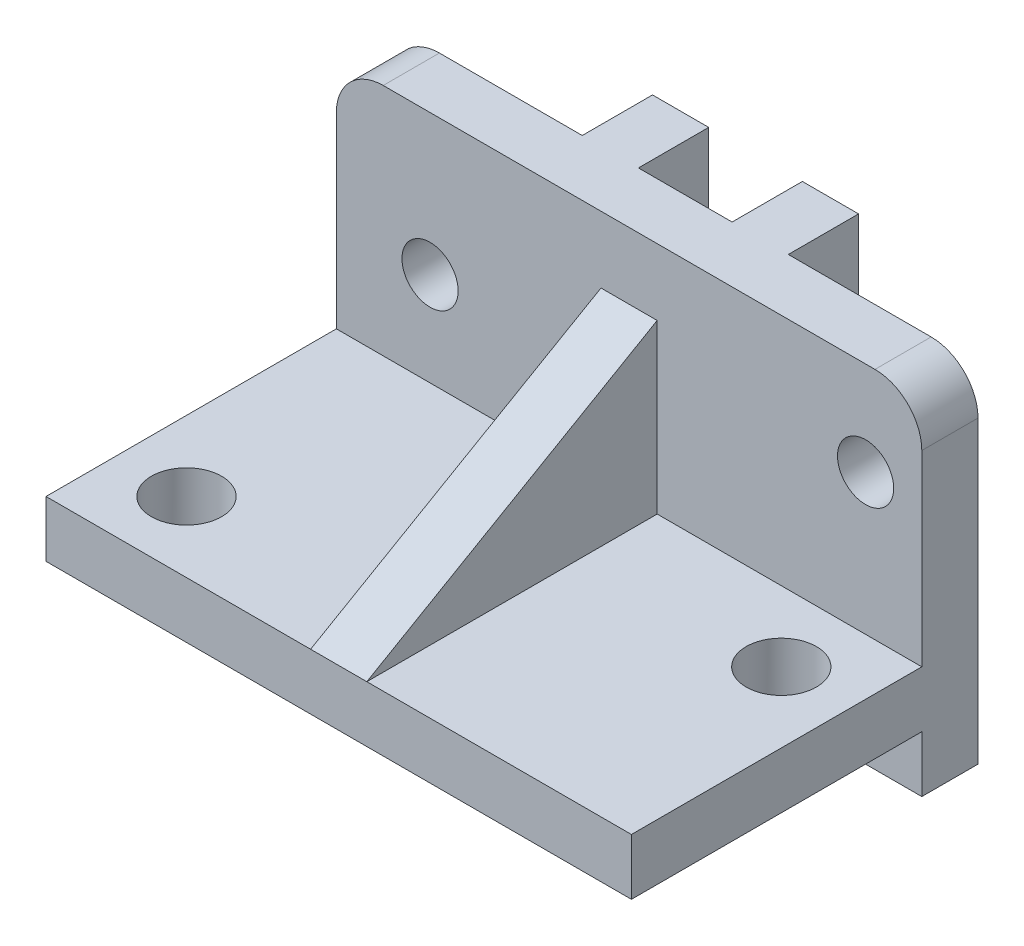
ISO-10303-21;
HEADER;
FILE_DESCRIPTION(('STEP AP214'),'2;1');
FILE_NAME('part.step','',(''),(''),'','','');
FILE_SCHEMA(('AUTOMOTIVE_DESIGN { 1 0 10303 214 1 1 1 1 }'));
ENDSEC;
DATA;
#1=APPLICATION_CONTEXT('core data for automotive mechanical design processes');
#2=APPLICATION_PROTOCOL_DEFINITION('international standard','automotive_design',2000,#1);
#3=PRODUCT_CONTEXT('',#1,'mechanical');
#4=PRODUCT('Part','Part','',(#3));
#5=PRODUCT_RELATED_PRODUCT_CATEGORY('part','',(#4));
#6=PRODUCT_DEFINITION_FORMATION('','',#4);
#7=PRODUCT_DEFINITION_CONTEXT('part definition',#1,'design');
#8=PRODUCT_DEFINITION('design','',#6,#7);
#9=PRODUCT_DEFINITION_SHAPE('','',#8);
#10=(LENGTH_UNIT() NAMED_UNIT(*) SI_UNIT(.MILLI.,.METRE.));
#11=(NAMED_UNIT(*) PLANE_ANGLE_UNIT() SI_UNIT($,.RADIAN.));
#12=(NAMED_UNIT(*) SI_UNIT($,.STERADIAN.) SOLID_ANGLE_UNIT());
#13=UNCERTAINTY_MEASURE_WITH_UNIT(LENGTH_MEASURE(1.E-05),#10,'distance_accuracy_value','');
#14=(GEOMETRIC_REPRESENTATION_CONTEXT(3) GLOBAL_UNCERTAINTY_ASSIGNED_CONTEXT((#13)) GLOBAL_UNIT_ASSIGNED_CONTEXT((#10,
#11,#12)) REPRESENTATION_CONTEXT('',''));
#15=CARTESIAN_POINT('',(0.,0.,0.));
#16=DIRECTION('',(0.,0.,1.));
#17=DIRECTION('',(1.,0.,0.));
#18=AXIS2_PLACEMENT_3D('',#15,#16,#17);
#19=CARTESIAN_POINT('',(-125.,12.,-62.));
#20=DIRECTION('',(0.,1.,0.));
#21=DIRECTION('',(0.,0.,1.));
#22=AXIS2_PLACEMENT_3D('',#19,#20,#21);
#23=PLANE('',#22);
#24=CARTESIAN_POINT('',(-15.,12.,-47.));
#25=DIRECTION('',(0.,1.,0.));
#26=DIRECTION('',(0.,0.,1.));
#27=AXIS2_PLACEMENT_3D('',#24,#25,#26);
#28=CIRCLE('',#27,7.5);
#29=CARTESIAN_POINT('',(-15.,12.,-39.5));
#30=VERTEX_POINT('',#29);
#31=EDGE_CURVE('E226',#30,#30,#28,.T.);
#32=ORIENTED_EDGE('',*,*,#31,.F.);
#33=EDGE_LOOP('',(#32));
#34=FACE_BOUND('',#33,.T.);
#35=DIRECTION('',(1.,0.,0.));
#36=VECTOR('',#35,1.);
#37=CARTESIAN_POINT('',(-125.,12.,-62.));
#38=LINE('',#37,#36);
#39=CARTESIAN_POINT('',(-56.5,12.,-62.));
#40=VERTEX_POINT('',#39);
#41=CARTESIAN_POINT('',(0.,12.,-62.));
#42=VERTEX_POINT('',#41);
#43=EDGE_CURVE('E194',#40,#42,#38,.T.);
#44=ORIENTED_EDGE('',*,*,#43,.F.);
#45=DIRECTION('',(0.,0.,-1.));
#46=VECTOR('',#45,1.);
#47=CARTESIAN_POINT('',(-56.5,12.,0.));
#48=LINE('',#47,#46);
#49=CARTESIAN_POINT('',(-56.5,12.,0.));
#50=VERTEX_POINT('',#49);
#51=EDGE_CURVE('E54',#50,#40,#48,.T.);
#52=ORIENTED_EDGE('',*,*,#51,.F.);
#53=DIRECTION('',(1.,0.,0.));
#54=VECTOR('',#53,1.);
#55=CARTESIAN_POINT('',(-125.,12.,0.));
#56=LINE('',#55,#54);
#57=CARTESIAN_POINT('',(0.,12.,0.));
#58=VERTEX_POINT('',#57);
#59=EDGE_CURVE('E193',#50,#58,#56,.T.);
#60=ORIENTED_EDGE('',*,*,#59,.T.);
#61=DIRECTION('',(0.,0.,1.));
#62=VECTOR('',#61,1.);
#63=CARTESIAN_POINT('',(0.,12.,-62.));
#64=LINE('',#63,#62);
#65=EDGE_CURVE('E289',#42,#58,#64,.T.);
#66=ORIENTED_EDGE('',*,*,#65,.F.);
#67=EDGE_LOOP('',(#44,#52,#60,#66));
#68=FACE_BOUND('',#67,.T.);
#69=ADVANCED_FACE('F37',(#34,#68),#23,.T.);
#70=CARTESIAN_POINT('',(-125.,62.,-62.));
#71=DIRECTION('',(0.,0.,1.));
#72=DIRECTION('',(0.,-1.,0.));
#73=AXIS2_PLACEMENT_3D('',#70,#71,#72);
#74=PLANE('',#73);
#75=CARTESIAN_POINT('',(-12.,42.,-62.));
#76=DIRECTION('',(0.,0.,1.));
#77=DIRECTION('',(1.,0.,0.));
#78=AXIS2_PLACEMENT_3D('',#75,#76,#77);
#79=CIRCLE('',#78,6.);
#80=CARTESIAN_POINT('',(-6.,42.,-62.));
#81=VERTEX_POINT('',#80);
#82=EDGE_CURVE('E218',#81,#81,#79,.T.);
#83=ORIENTED_EDGE('',*,*,#82,.F.);
#84=EDGE_LOOP('',(#83));
#85=FACE_BOUND('',#84,.T.);
#86=CARTESIAN_POINT('',(-105.,32.,-62.));
#87=DIRECTION('',(0.,0.,1.));
#88=DIRECTION('',(1.,0.,0.));
#89=AXIS2_PLACEMENT_3D('',#86,#87,#88);
#90=CIRCLE('',#89,6.);
#91=CARTESIAN_POINT('',(-99.,32.,-62.));
#92=VERTEX_POINT('',#91);
#93=EDGE_CURVE('E217',#92,#92,#90,.T.);
#94=ORIENTED_EDGE('',*,*,#93,.F.);
#95=EDGE_LOOP('',(#94));
#96=FACE_BOUND('',#95,.T.);
#97=DIRECTION('',(-1.,0.,0.));
#98=VECTOR('',#97,1.);
#99=CARTESIAN_POINT('',(-56.5,47.7957166897569,-62.));
#100=LINE('',#99,#98);
#101=CARTESIAN_POINT('',(-56.5,47.7957166897569,-62.));
#102=VERTEX_POINT('',#101);
#103=CARTESIAN_POINT('',(-68.5,47.7957166897569,-62.));
#104=VERTEX_POINT('',#103);
#105=EDGE_CURVE('E213',#102,#104,#100,.T.);
#106=ORIENTED_EDGE('',*,*,#105,.F.);
#107=DIRECTION('',(0.,1.,0.));
#108=VECTOR('',#107,1.);
#109=CARTESIAN_POINT('',(-56.5,47.7957166897569,-62.));
#110=LINE('',#109,#108);
#111=EDGE_CURVE('E215',#40,#102,#110,.T.);
#112=ORIENTED_EDGE('',*,*,#111,.F.);
#113=ORIENTED_EDGE('',*,*,#43,.T.);
#114=DIRECTION('',(0.,-1.,0.));
#115=VECTOR('',#114,1.);
#116=CARTESIAN_POINT('',(0.,62.,-62.));
#117=LINE('',#116,#115);
#118=CARTESIAN_POINT('',(0.,52.,-62.));
#119=VERTEX_POINT('',#118);
#120=EDGE_CURVE('E319',#119,#42,#117,.T.);
#121=ORIENTED_EDGE('',*,*,#120,.F.);
#122=CARTESIAN_POINT('',(-10.,52.,-62.));
#123=DIRECTION('',(0.,0.,1.));
#124=DIRECTION('',(0.,-1.,0.));
#125=AXIS2_PLACEMENT_3D('',#122,#123,#124);
#126=CIRCLE('',#125,10.);
#127=CARTESIAN_POINT('',(-9.99999999999999,62.,-62.));
#128=VERTEX_POINT('',#127);
#129=EDGE_CURVE('E349',#119,#128,#126,.T.);
#130=ORIENTED_EDGE('',*,*,#129,.T.);
#131=DIRECTION('',(1.,0.,0.));
#132=VECTOR('',#131,1.);
#133=CARTESIAN_POINT('',(-125.,62.,-62.));
#134=LINE('',#133,#132);
#135=CARTESIAN_POINT('',(-115.,62.,-62.));
#136=VERTEX_POINT('',#135);
#137=EDGE_CURVE('E326',#136,#128,#134,.T.);
#138=ORIENTED_EDGE('',*,*,#137,.F.);
#139=CARTESIAN_POINT('',(-115.,52.,-62.));
#140=DIRECTION('',(0.,0.,1.));
#141=DIRECTION('',(0.,-1.,0.));
#142=AXIS2_PLACEMENT_3D('',#139,#140,#141);
#143=CIRCLE('',#142,10.);
#144=CARTESIAN_POINT('',(-125.,52.,-62.));
#145=VERTEX_POINT('',#144);
#146=EDGE_CURVE('E351',#136,#145,#143,.T.);
#147=ORIENTED_EDGE('',*,*,#146,.T.);
#148=DIRECTION('',(0.,-1.,0.));
#149=VECTOR('',#148,1.);
#150=CARTESIAN_POINT('',(-125.,62.,-62.));
#151=LINE('',#150,#149);
#152=CARTESIAN_POINT('',(-125.,12.,-62.));
#153=VERTEX_POINT('',#152);
#154=EDGE_CURVE('E189',#145,#153,#151,.T.);
#155=ORIENTED_EDGE('',*,*,#154,.T.);
#156=CARTESIAN_POINT('',(-68.5,12.,-62.));
#157=VERTEX_POINT('',#156);
#158=EDGE_CURVE('E182',#153,#157,#38,.T.);
#159=ORIENTED_EDGE('',*,*,#158,.T.);
#160=DIRECTION('',(0.,1.,0.));
#161=VECTOR('',#160,1.);
#162=CARTESIAN_POINT('',(-68.5,47.7957166897569,-62.));
#163=LINE('',#162,#161);
#164=EDGE_CURVE('E186',#157,#104,#163,.T.);
#165=ORIENTED_EDGE('',*,*,#164,.T.);
#166=EDGE_LOOP('',(#106,#112,#113,#121,#130,#138,#147,#155,#159,#165));
#167=FACE_BOUND('',#166,.T.);
#168=ADVANCED_FACE('F184',(#85,#96,#167),#74,.T.);
#169=CARTESIAN_POINT('',(-125.,-12.,-74.));
#170=DIRECTION('',(0.,0.,-1.));
#171=DIRECTION('',(-1.,0.,0.));
#172=AXIS2_PLACEMENT_3D('',#169,#170,#171);
#173=PLANE('',#172);
#174=CARTESIAN_POINT('',(-12.,42.,-74.));
#175=DIRECTION('',(0.,0.,-1.));
#176=DIRECTION('',(-1.,0.,0.));
#177=AXIS2_PLACEMENT_3D('',#174,#175,#176);
#178=CIRCLE('',#177,6.);
#179=CARTESIAN_POINT('',(-18.,42.,-74.));
#180=VERTEX_POINT('',#179);
#181=EDGE_CURVE('E223',#180,#180,#178,.T.);
#182=ORIENTED_EDGE('',*,*,#181,.F.);
#183=EDGE_LOOP('',(#182));
#184=FACE_BOUND('',#183,.T.);
#185=DIRECTION('',(1.,0.,0.));
#186=VECTOR('',#185,1.);
#187=CARTESIAN_POINT('',(-125.,-12.,-74.));
#188=LINE('',#187,#186);
#189=CARTESIAN_POINT('',(-40.5,-12.,-74.));
#190=VERTEX_POINT('',#189);
#191=CARTESIAN_POINT('',(0.,-12.,-74.));
#192=VERTEX_POINT('',#191);
#193=EDGE_CURVE('E338',#190,#192,#188,.T.);
#194=ORIENTED_EDGE('',*,*,#193,.F.);
#195=DIRECTION('',(0.,1.,0.));
#196=VECTOR('',#195,1.);
#197=CARTESIAN_POINT('',(-40.5,-12.,-74.));
#198=LINE('',#197,#196);
#199=CARTESIAN_POINT('',(-40.5,62.,-74.));
#200=VERTEX_POINT('',#199);
#201=EDGE_CURVE('E236',#190,#200,#198,.T.);
#202=ORIENTED_EDGE('',*,*,#201,.T.);
#203=DIRECTION('',(1.,0.,0.));
#204=VECTOR('',#203,1.);
#205=CARTESIAN_POINT('',(-125.,62.,-74.));
#206=LINE('',#205,#204);
#207=CARTESIAN_POINT('',(-9.99999999999999,62.,-74.));
#208=VERTEX_POINT('',#207);
#209=EDGE_CURVE('E333',#200,#208,#206,.T.);
#210=ORIENTED_EDGE('',*,*,#209,.T.);
#211=CARTESIAN_POINT('',(-10.,52.,-74.));
#212=DIRECTION('',(0.,0.,-1.));
#213=DIRECTION('',(-1.,0.,0.));
#214=AXIS2_PLACEMENT_3D('',#211,#212,#213);
#215=CIRCLE('',#214,10.);
#216=CARTESIAN_POINT('',(0.,52.,-74.));
#217=VERTEX_POINT('',#216);
#218=EDGE_CURVE('E355',#208,#217,#215,.T.);
#219=ORIENTED_EDGE('',*,*,#218,.T.);
#220=DIRECTION('',(0.,1.,0.));
#221=VECTOR('',#220,1.);
#222=CARTESIAN_POINT('',(0.,-12.,-74.));
#223=LINE('',#222,#221);
#224=EDGE_CURVE('E316',#192,#217,#223,.T.);
#225=ORIENTED_EDGE('',*,*,#224,.F.);
#226=EDGE_LOOP('',(#194,#202,#210,#219,#225));
#227=FACE_BOUND('',#226,.T.);
#228=ADVANCED_FACE('F394',(#184,#227),#173,.T.);
#229=CARTESIAN_POINT('',(-72.5,62.,-74.));
#230=VERTEX_POINT('',#229);
#231=CARTESIAN_POINT('',(-52.5,62.,-74.));
#232=VERTEX_POINT('',#231);
#233=EDGE_CURVE('E332',#230,#232,#206,.T.);
#234=ORIENTED_EDGE('',*,*,#233,.T.);
#235=DIRECTION('',(0.,1.,0.));
#236=VECTOR('',#235,1.);
#237=CARTESIAN_POINT('',(-52.5,-12.,-74.));
#238=LINE('',#237,#236);
#239=CARTESIAN_POINT('',(-52.5,-12.,-74.));
#240=VERTEX_POINT('',#239);
#241=EDGE_CURVE('E240',#240,#232,#238,.T.);
#242=ORIENTED_EDGE('',*,*,#241,.F.);
#243=CARTESIAN_POINT('',(-72.5,-12.,-74.));
#244=VERTEX_POINT('',#243);
#245=EDGE_CURVE('E337',#244,#240,#188,.T.);
#246=ORIENTED_EDGE('',*,*,#245,.F.);
#247=DIRECTION('',(0.,1.,0.));
#248=VECTOR('',#247,1.);
#249=CARTESIAN_POINT('',(-72.5,-12.,-74.));
#250=LINE('',#249,#248);
#251=EDGE_CURVE('E268',#244,#230,#250,.T.);
#252=ORIENTED_EDGE('',*,*,#251,.T.);
#253=EDGE_LOOP('',(#234,#242,#246,#252));
#254=FACE_BOUND('',#253,.T.);
#255=ADVANCED_FACE('F440',(#254),#173,.T.);
#256=CARTESIAN_POINT('',(-125.,12.,0.));
#257=DIRECTION('',(0.,0.,1.));
#258=DIRECTION('',(1.,0.,0.));
#259=AXIS2_PLACEMENT_3D('',#256,#257,#258);
#260=PLANE('',#259);
#261=DIRECTION('',(0.,-1.,0.));
#262=VECTOR('',#261,1.);
#263=CARTESIAN_POINT('',(0.,12.,0.));
#264=LINE('',#263,#262);
#265=CARTESIAN_POINT('',(0.,0.,0.));
#266=VERTEX_POINT('',#265);
#267=EDGE_CURVE('E284',#58,#266,#264,.T.);
#268=ORIENTED_EDGE('',*,*,#267,.F.);
#269=ORIENTED_EDGE('',*,*,#59,.F.);
#270=DIRECTION('',(-1.,0.,0.));
#271=VECTOR('',#270,1.);
#272=CARTESIAN_POINT('',(-56.5,12.,0.));
#273=LINE('',#272,#271);
#274=CARTESIAN_POINT('',(-68.5,12.,0.));
#275=VERTEX_POINT('',#274);
#276=EDGE_CURVE('E61',#50,#275,#273,.T.);
#277=ORIENTED_EDGE('',*,*,#276,.T.);
#278=CARTESIAN_POINT('',(-125.,12.,0.));
#279=VERTEX_POINT('',#278);
#280=EDGE_CURVE('E200',#279,#275,#56,.T.);
#281=ORIENTED_EDGE('',*,*,#280,.F.);
#282=DIRECTION('',(0.,-1.,0.));
#283=VECTOR('',#282,1.);
#284=CARTESIAN_POINT('',(-125.,12.,0.));
#285=LINE('',#284,#283);
#286=CARTESIAN_POINT('',(-125.,0.,0.));
#287=VERTEX_POINT('',#286);
#288=EDGE_CURVE('E285',#279,#287,#285,.T.);
#289=ORIENTED_EDGE('',*,*,#288,.T.);
#290=DIRECTION('',(1.,0.,0.));
#291=VECTOR('',#290,1.);
#292=CARTESIAN_POINT('',(-125.,0.,0.));
#293=LINE('',#292,#291);
#294=EDGE_CURVE('E304',#287,#266,#293,.T.);
#295=ORIENTED_EDGE('',*,*,#294,.T.);
#296=EDGE_LOOP('',(#268,#269,#277,#281,#289,#295));
#297=FACE_BOUND('',#296,.T.);
#298=ADVANCED_FACE('F380',(#297),#260,.T.);
#299=DIRECTION('',(0.,0.,-1.));
#300=VECTOR('',#299,1.);
#301=CARTESIAN_POINT('',(-68.5,12.,0.));
#302=LINE('',#301,#300);
#303=EDGE_CURVE('E197',#275,#157,#302,.T.);
#304=ORIENTED_EDGE('',*,*,#303,.T.);
#305=ORIENTED_EDGE('',*,*,#158,.F.);
#306=DIRECTION('',(0.,0.,1.));
#307=VECTOR('',#306,1.);
#308=CARTESIAN_POINT('',(-125.,12.,-62.));
#309=LINE('',#308,#307);
#310=EDGE_CURVE('E302',#153,#279,#309,.T.);
#311=ORIENTED_EDGE('',*,*,#310,.T.);
#312=ORIENTED_EDGE('',*,*,#280,.T.);
#313=EDGE_LOOP('',(#304,#305,#311,#312));
#314=FACE_BOUND('',#313,.T.);
#315=CARTESIAN_POINT('',(-110.,12.,-15.));
#316=DIRECTION('',(0.,1.,0.));
#317=DIRECTION('',(0.,0.,1.));
#318=AXIS2_PLACEMENT_3D('',#315,#316,#317);
#319=CIRCLE('',#318,7.50000000000001);
#320=CARTESIAN_POINT('',(-110.,12.,-7.49999999999998));
#321=VERTEX_POINT('',#320);
#322=EDGE_CURVE('E227',#321,#321,#319,.T.);
#323=ORIENTED_EDGE('',*,*,#322,.F.);
#324=EDGE_LOOP('',(#323));
#325=FACE_BOUND('',#324,.T.);
#326=ADVANCED_FACE('F198',(#314,#325),#23,.T.);
#327=CARTESIAN_POINT('',(-125.,62.,-74.));
#328=DIRECTION('',(0.,1.,0.));
#329=DIRECTION('',(0.,0.,1.));
#330=AXIS2_PLACEMENT_3D('',#327,#328,#329);
#331=PLANE('',#330);
#332=CARTESIAN_POINT('',(-115.,62.,-74.));
#333=VERTEX_POINT('',#332);
#334=CARTESIAN_POINT('',(-84.5,62.,-74.));
#335=VERTEX_POINT('',#334);
#336=EDGE_CURVE('E329',#333,#335,#206,.T.);
#337=ORIENTED_EDGE('',*,*,#336,.F.);
#338=DIRECTION('',(0.,0.,1.));
#339=VECTOR('',#338,1.);
#340=CARTESIAN_POINT('',(-115.,62.,-62.));
#341=LINE('',#340,#339);
#342=EDGE_CURVE('E346',#333,#136,#341,.T.);
#343=ORIENTED_EDGE('',*,*,#342,.T.);
#344=ORIENTED_EDGE('',*,*,#137,.T.);
#345=DIRECTION('',(0.,0.,1.));
#346=VECTOR('',#345,1.);
#347=CARTESIAN_POINT('',(-9.99999999999999,62.,-74.));
#348=LINE('',#347,#346);
#349=EDGE_CURVE('E324',#128,#208,#348,.F.);
#350=ORIENTED_EDGE('',*,*,#349,.T.);
#351=ORIENTED_EDGE('',*,*,#209,.F.);
#352=DIRECTION('',(0.,0.,1.));
#353=VECTOR('',#352,1.);
#354=CARTESIAN_POINT('',(-40.5,62.,-89.));
#355=LINE('',#354,#353);
#356=CARTESIAN_POINT('',(-40.5,62.,-89.));
#357=VERTEX_POINT('',#356);
#358=EDGE_CURVE('E248',#357,#200,#355,.T.);
#359=ORIENTED_EDGE('',*,*,#358,.F.);
#360=DIRECTION('',(1.,0.,0.));
#361=VECTOR('',#360,1.);
#362=CARTESIAN_POINT('',(-52.5,62.,-89.));
#363=LINE('',#362,#361);
#364=CARTESIAN_POINT('',(-52.5,62.,-89.));
#365=VERTEX_POINT('',#364);
#366=EDGE_CURVE('E251',#365,#357,#363,.T.);
#367=ORIENTED_EDGE('',*,*,#366,.F.);
#368=DIRECTION('',(0.,0.,-1.));
#369=VECTOR('',#368,1.);
#370=CARTESIAN_POINT('',(-52.5,62.,-74.));
#371=LINE('',#370,#369);
#372=EDGE_CURVE('E246',#232,#365,#371,.T.);
#373=ORIENTED_EDGE('',*,*,#372,.F.);
#374=ORIENTED_EDGE('',*,*,#233,.F.);
#375=DIRECTION('',(0.,0.,1.));
#376=VECTOR('',#375,1.);
#377=CARTESIAN_POINT('',(-72.5,62.,-74.));
#378=LINE('',#377,#376);
#379=CARTESIAN_POINT('',(-72.5,62.,-89.));
#380=VERTEX_POINT('',#379);
#381=EDGE_CURVE('E264',#380,#230,#378,.T.);
#382=ORIENTED_EDGE('',*,*,#381,.F.);
#383=DIRECTION('',(1.,0.,0.));
#384=VECTOR('',#383,1.);
#385=CARTESIAN_POINT('',(-72.5,62.,-89.));
#386=LINE('',#385,#384);
#387=CARTESIAN_POINT('',(-84.5,62.,-89.));
#388=VERTEX_POINT('',#387);
#389=EDGE_CURVE('E270',#388,#380,#386,.T.);
#390=ORIENTED_EDGE('',*,*,#389,.F.);
#391=DIRECTION('',(0.,0.,-1.));
#392=VECTOR('',#391,1.);
#393=CARTESIAN_POINT('',(-84.5,62.,-89.));
#394=LINE('',#393,#392);
#395=EDGE_CURVE('E254',#335,#388,#394,.T.);
#396=ORIENTED_EDGE('',*,*,#395,.F.);
#397=EDGE_LOOP('',(#337,#343,#344,#350,#351,#359,#367,#373,#374,#382,#390,#396));
#398=FACE_BOUND('',#397,.T.);
#399=ADVANCED_FACE('F432',(#398),#331,.T.);
#400=CARTESIAN_POINT('',(-105.,32.,-74.));
#401=DIRECTION('',(0.,0.,-1.));
#402=DIRECTION('',(-1.,0.,0.));
#403=AXIS2_PLACEMENT_3D('',#400,#401,#402);
#404=CIRCLE('',#403,6.);
#405=CARTESIAN_POINT('',(-111.,32.,-74.));
#406=VERTEX_POINT('',#405);
#407=EDGE_CURVE('E41',#406,#406,#404,.T.);
#408=ORIENTED_EDGE('',*,*,#407,.F.);
#409=EDGE_LOOP('',(#408));
#410=FACE_BOUND('',#409,.T.);
#411=DIRECTION('',(0.,1.,0.));
#412=VECTOR('',#411,1.);
#413=CARTESIAN_POINT('',(-84.5,-12.,-74.));
#414=LINE('',#413,#412);
#415=CARTESIAN_POINT('',(-84.5,-12.,-74.));
#416=VERTEX_POINT('',#415);
#417=EDGE_CURVE('E281',#416,#335,#414,.T.);
#418=ORIENTED_EDGE('',*,*,#417,.F.);
#419=CARTESIAN_POINT('',(-125.,-12.,-74.));
#420=VERTEX_POINT('',#419);
#421=EDGE_CURVE('E334',#420,#416,#188,.T.);
#422=ORIENTED_EDGE('',*,*,#421,.F.);
#423=DIRECTION('',(0.,1.,0.));
#424=VECTOR('',#423,1.);
#425=CARTESIAN_POINT('',(-125.,-12.,-74.));
#426=LINE('',#425,#424);
#427=CARTESIAN_POINT('',(-125.,52.,-74.));
#428=VERTEX_POINT('',#427);
#429=EDGE_CURVE('E298',#420,#428,#426,.T.);
#430=ORIENTED_EDGE('',*,*,#429,.T.);
#431=CARTESIAN_POINT('',(-115.,52.,-74.));
#432=DIRECTION('',(0.,0.,-1.));
#433=DIRECTION('',(-1.,0.,0.));
#434=AXIS2_PLACEMENT_3D('',#431,#432,#433);
#435=CIRCLE('',#434,10.);
#436=EDGE_CURVE('E46',#428,#333,#435,.T.);
#437=ORIENTED_EDGE('',*,*,#436,.T.);
#438=ORIENTED_EDGE('',*,*,#336,.T.);
#439=EDGE_LOOP('',(#418,#422,#430,#437,#438));
#440=FACE_BOUND('',#439,.T.);
#441=ADVANCED_FACE('F437',(#410,#440),#173,.T.);
#442=CARTESIAN_POINT('',(-125.,-12.,-62.));
#443=DIRECTION('',(0.,-1.,0.));
#444=DIRECTION('',(0.,0.,-1.));
#445=AXIS2_PLACEMENT_3D('',#442,#443,#444);
#446=PLANE('',#445);
#447=DIRECTION('',(0.,0.,-1.));
#448=VECTOR('',#447,1.);
#449=CARTESIAN_POINT('',(0.,-12.,-62.));
#450=LINE('',#449,#448);
#451=CARTESIAN_POINT('',(0.,-12.,-62.));
#452=VERTEX_POINT('',#451);
#453=EDGE_CURVE('E313',#452,#192,#450,.T.);
#454=ORIENTED_EDGE('',*,*,#453,.F.);
#455=DIRECTION('',(1.,0.,0.));
#456=VECTOR('',#455,1.);
#457=CARTESIAN_POINT('',(-125.,-12.,-62.));
#458=LINE('',#457,#456);
#459=CARTESIAN_POINT('',(-125.,-12.,-62.));
#460=VERTEX_POINT('',#459);
#461=EDGE_CURVE('E339',#460,#452,#458,.T.);
#462=ORIENTED_EDGE('',*,*,#461,.F.);
#463=DIRECTION('',(0.,0.,-1.));
#464=VECTOR('',#463,1.);
#465=CARTESIAN_POINT('',(-125.,-12.,-62.));
#466=LINE('',#465,#464);
#467=EDGE_CURVE('E295',#460,#420,#466,.T.);
#468=ORIENTED_EDGE('',*,*,#467,.T.);
#469=ORIENTED_EDGE('',*,*,#421,.T.);
#470=DIRECTION('',(0.,0.,-1.));
#471=VECTOR('',#470,1.);
#472=CARTESIAN_POINT('',(-84.5,-12.,-89.));
#473=LINE('',#472,#471);
#474=CARTESIAN_POINT('',(-84.5,-12.,-89.));
#475=VERTEX_POINT('',#474);
#476=EDGE_CURVE('E261',#416,#475,#473,.T.);
#477=ORIENTED_EDGE('',*,*,#476,.T.);
#478=DIRECTION('',(1.,0.,0.));
#479=VECTOR('',#478,1.);
#480=CARTESIAN_POINT('',(-72.5,-12.,-89.));
#481=LINE('',#480,#479);
#482=CARTESIAN_POINT('',(-72.5,-12.,-89.));
#483=VERTEX_POINT('',#482);
#484=EDGE_CURVE('E263',#475,#483,#481,.T.);
#485=ORIENTED_EDGE('',*,*,#484,.T.);
#486=DIRECTION('',(0.,0.,1.));
#487=VECTOR('',#486,1.);
#488=CARTESIAN_POINT('',(-72.5,-12.,-74.));
#489=LINE('',#488,#487);
#490=EDGE_CURVE('E266',#483,#244,#489,.T.);
#491=ORIENTED_EDGE('',*,*,#490,.T.);
#492=ORIENTED_EDGE('',*,*,#245,.T.);
#493=DIRECTION('',(0.,0.,-1.));
#494=VECTOR('',#493,1.);
#495=CARTESIAN_POINT('',(-52.5,-12.,-74.));
#496=LINE('',#495,#494);
#497=CARTESIAN_POINT('',(-52.5,-12.,-89.));
#498=VERTEX_POINT('',#497);
#499=EDGE_CURVE('E245',#240,#498,#496,.T.);
#500=ORIENTED_EDGE('',*,*,#499,.T.);
#501=DIRECTION('',(1.,0.,0.));
#502=VECTOR('',#501,1.);
#503=CARTESIAN_POINT('',(-52.5,-12.,-89.));
#504=LINE('',#503,#502);
#505=CARTESIAN_POINT('',(-40.5,-12.,-89.));
#506=VERTEX_POINT('',#505);
#507=EDGE_CURVE('E249',#498,#506,#504,.T.);
#508=ORIENTED_EDGE('',*,*,#507,.T.);
#509=DIRECTION('',(0.,0.,1.));
#510=VECTOR('',#509,1.);
#511=CARTESIAN_POINT('',(-40.5,-12.,-89.));
#512=LINE('',#511,#510);
#513=EDGE_CURVE('E256',#506,#190,#512,.T.);
#514=ORIENTED_EDGE('',*,*,#513,.T.);
#515=ORIENTED_EDGE('',*,*,#193,.T.);
#516=EDGE_LOOP('',(#454,#462,#468,#469,#477,#485,#491,#492,#500,#508,#514,#515));
#517=FACE_BOUND('',#516,.T.);
#518=ADVANCED_FACE('F391',(#517),#446,.T.);
#519=CARTESIAN_POINT('',(-125.,0.,-62.));
#520=DIRECTION('',(0.,0.,1.));
#521=DIRECTION('',(0.,-1.,0.));
#522=AXIS2_PLACEMENT_3D('',#519,#520,#521);
#523=PLANE('',#522);
#524=DIRECTION('',(0.,-1.,0.));
#525=VECTOR('',#524,1.);
#526=CARTESIAN_POINT('',(0.,0.,-62.));
#527=LINE('',#526,#525);
#528=CARTESIAN_POINT('',(0.,0.,-62.));
#529=VERTEX_POINT('',#528);
#530=EDGE_CURVE('E310',#529,#452,#527,.T.);
#531=ORIENTED_EDGE('',*,*,#530,.F.);
#532=DIRECTION('',(1.,0.,0.));
#533=VECTOR('',#532,1.);
#534=CARTESIAN_POINT('',(-125.,0.,-62.));
#535=LINE('',#534,#533);
#536=CARTESIAN_POINT('',(-125.,0.,-62.));
#537=VERTEX_POINT('',#536);
#538=EDGE_CURVE('E341',#537,#529,#535,.T.);
#539=ORIENTED_EDGE('',*,*,#538,.F.);
#540=DIRECTION('',(0.,-1.,0.));
#541=VECTOR('',#540,1.);
#542=CARTESIAN_POINT('',(-125.,0.,-62.));
#543=LINE('',#542,#541);
#544=EDGE_CURVE('E292',#537,#460,#543,.T.);
#545=ORIENTED_EDGE('',*,*,#544,.T.);
#546=ORIENTED_EDGE('',*,*,#461,.T.);
#547=EDGE_LOOP('',(#531,#539,#545,#546));
#548=FACE_BOUND('',#547,.T.);
#549=ADVANCED_FACE('F369',(#548),#523,.T.);
#550=CARTESIAN_POINT('',(-125.,0.,0.));
#551=DIRECTION('',(0.,-1.,0.));
#552=DIRECTION('',(0.,0.,-1.));
#553=AXIS2_PLACEMENT_3D('',#550,#551,#552);
#554=PLANE('',#553);
#555=CARTESIAN_POINT('',(-110.,0.,-15.));
#556=DIRECTION('',(0.,-1.,0.));
#557=DIRECTION('',(0.,0.,-1.));
#558=AXIS2_PLACEMENT_3D('',#555,#556,#557);
#559=CIRCLE('',#558,7.50000000000001);
#560=CARTESIAN_POINT('',(-110.,0.,-22.5));
#561=VERTEX_POINT('',#560);
#562=EDGE_CURVE('E237',#561,#561,#559,.T.);
#563=ORIENTED_EDGE('',*,*,#562,.F.);
#564=EDGE_LOOP('',(#563));
#565=FACE_BOUND('',#564,.T.);
#566=CARTESIAN_POINT('',(-15.,0.,-47.));
#567=DIRECTION('',(0.,-1.,0.));
#568=DIRECTION('',(0.,0.,-1.));
#569=AXIS2_PLACEMENT_3D('',#566,#567,#568);
#570=CIRCLE('',#569,7.5);
#571=CARTESIAN_POINT('',(-15.,0.,-54.5));
#572=VERTEX_POINT('',#571);
#573=EDGE_CURVE('E230',#572,#572,#570,.T.);
#574=ORIENTED_EDGE('',*,*,#573,.F.);
#575=EDGE_LOOP('',(#574));
#576=FACE_BOUND('',#575,.T.);
#577=DIRECTION('',(0.,0.,-1.));
#578=VECTOR('',#577,1.);
#579=CARTESIAN_POINT('',(0.,0.,0.));
#580=LINE('',#579,#578);
#581=EDGE_CURVE('E307',#266,#529,#580,.T.);
#582=ORIENTED_EDGE('',*,*,#581,.F.);
#583=ORIENTED_EDGE('',*,*,#294,.F.);
#584=DIRECTION('',(0.,0.,-1.));
#585=VECTOR('',#584,1.);
#586=CARTESIAN_POINT('',(-125.,0.,0.));
#587=LINE('',#586,#585);
#588=EDGE_CURVE('E288',#287,#537,#587,.T.);
#589=ORIENTED_EDGE('',*,*,#588,.T.);
#590=ORIENTED_EDGE('',*,*,#538,.T.);
#591=EDGE_LOOP('',(#582,#583,#589,#590));
#592=FACE_BOUND('',#591,.T.);
#593=ADVANCED_FACE('F365',(#565,#576,#592),#554,.T.);
#594=CARTESIAN_POINT('',(-125.,0.,0.));
#595=DIRECTION('',(1.,0.,0.));
#596=DIRECTION('',(0.,0.,-1.));
#597=AXIS2_PLACEMENT_3D('',#594,#595,#596);
#598=PLANE('',#597);
#599=ORIENTED_EDGE('',*,*,#154,.F.);
#600=DIRECTION('',(0.,0.,1.));
#601=VECTOR('',#600,1.);
#602=CARTESIAN_POINT('',(-125.,52.,-74.));
#603=LINE('',#602,#601);
#604=EDGE_CURVE('E353',#145,#428,#603,.F.);
#605=ORIENTED_EDGE('',*,*,#604,.T.);
#606=ORIENTED_EDGE('',*,*,#429,.F.);
#607=ORIENTED_EDGE('',*,*,#467,.F.);
#608=ORIENTED_EDGE('',*,*,#544,.F.);
#609=ORIENTED_EDGE('',*,*,#588,.F.);
#610=ORIENTED_EDGE('',*,*,#288,.F.);
#611=ORIENTED_EDGE('',*,*,#310,.F.);
#612=EDGE_LOOP('',(#599,#605,#606,#607,#608,#609,#610,#611));
#613=FACE_BOUND('',#612,.T.);
#614=ADVANCED_FACE('F368',(#613),#598,.F.);
#615=CARTESIAN_POINT('',(0.,0.,0.));
#616=DIRECTION('',(1.,0.,0.));
#617=DIRECTION('',(0.,0.,-1.));
#618=AXIS2_PLACEMENT_3D('',#615,#616,#617);
#619=PLANE('',#618);
#620=ORIENTED_EDGE('',*,*,#224,.T.);
#621=DIRECTION('',(0.,0.,1.));
#622=VECTOR('',#621,1.);
#623=CARTESIAN_POINT('',(0.,51.9999999999999,0.));
#624=LINE('',#623,#622);
#625=EDGE_CURVE('E11',#217,#119,#624,.T.);
#626=ORIENTED_EDGE('',*,*,#625,.T.);
#627=ORIENTED_EDGE('',*,*,#120,.T.);
#628=ORIENTED_EDGE('',*,*,#65,.T.);
#629=ORIENTED_EDGE('',*,*,#267,.T.);
#630=ORIENTED_EDGE('',*,*,#581,.T.);
#631=ORIENTED_EDGE('',*,*,#530,.T.);
#632=ORIENTED_EDGE('',*,*,#453,.T.);
#633=EDGE_LOOP('',(#620,#626,#627,#628,#629,#630,#631,#632));
#634=FACE_BOUND('',#633,.T.);
#635=ADVANCED_FACE('F378',(#634),#619,.T.);
#636=CARTESIAN_POINT('',(-115.,52.,-74.));
#637=DIRECTION('',(0.,0.,-1.));
#638=DIRECTION('',(0.,1.,0.));
#639=AXIS2_PLACEMENT_3D('',#636,#637,#638);
#640=CYLINDRICAL_SURFACE('',#639,10.);
#641=ORIENTED_EDGE('',*,*,#436,.F.);
#642=ORIENTED_EDGE('',*,*,#604,.F.);
#643=ORIENTED_EDGE('',*,*,#146,.F.);
#644=ORIENTED_EDGE('',*,*,#342,.F.);
#645=EDGE_LOOP('',(#641,#642,#643,#644));
#646=FACE_BOUND('',#645,.T.);
#647=ADVANCED_FACE('F448',(#646),#640,.T.);
#648=CARTESIAN_POINT('',(-10.,51.9999999999999,0.));
#649=DIRECTION('',(0.,0.,1.));
#650=DIRECTION('',(0.,-1.,0.));
#651=AXIS2_PLACEMENT_3D('',#648,#649,#650);
#652=CYLINDRICAL_SURFACE('',#651,10.);
#653=ORIENTED_EDGE('',*,*,#218,.F.);
#654=ORIENTED_EDGE('',*,*,#349,.F.);
#655=ORIENTED_EDGE('',*,*,#129,.F.);
#656=ORIENTED_EDGE('',*,*,#625,.F.);
#657=EDGE_LOOP('',(#653,#654,#655,#656));
#658=FACE_BOUND('',#657,.T.);
#659=ADVANCED_FACE('F39',(#658),#652,.T.);
#660=CARTESIAN_POINT('',(-84.5,-12.,-89.));
#661=DIRECTION('',(1.,0.,0.));
#662=DIRECTION('',(0.,0.,-1.));
#663=AXIS2_PLACEMENT_3D('',#660,#661,#662);
#664=PLANE('',#663);
#665=ORIENTED_EDGE('',*,*,#395,.T.);
#666=DIRECTION('',(0.,1.,0.));
#667=VECTOR('',#666,1.);
#668=CARTESIAN_POINT('',(-84.5,-12.,-89.));
#669=LINE('',#668,#667);
#670=EDGE_CURVE('E278',#475,#388,#669,.T.);
#671=ORIENTED_EDGE('',*,*,#670,.F.);
#672=ORIENTED_EDGE('',*,*,#476,.F.);
#673=ORIENTED_EDGE('',*,*,#417,.T.);
#674=EDGE_LOOP('',(#665,#671,#672,#673));
#675=FACE_BOUND('',#674,.T.);
#676=ADVANCED_FACE('F455',(#675),#664,.F.);
#677=CARTESIAN_POINT('',(-72.5,-12.,-89.));
#678=DIRECTION('',(0.,0.,1.));
#679=DIRECTION('',(1.,0.,0.));
#680=AXIS2_PLACEMENT_3D('',#677,#678,#679);
#681=PLANE('',#680);
#682=ORIENTED_EDGE('',*,*,#389,.T.);
#683=DIRECTION('',(0.,1.,0.));
#684=VECTOR('',#683,1.);
#685=CARTESIAN_POINT('',(-72.5,-12.,-89.));
#686=LINE('',#685,#684);
#687=EDGE_CURVE('E275',#483,#380,#686,.T.);
#688=ORIENTED_EDGE('',*,*,#687,.F.);
#689=ORIENTED_EDGE('',*,*,#484,.F.);
#690=ORIENTED_EDGE('',*,*,#670,.T.);
#691=EDGE_LOOP('',(#682,#688,#689,#690));
#692=FACE_BOUND('',#691,.T.);
#693=ADVANCED_FACE('F469',(#692),#681,.F.);
#694=CARTESIAN_POINT('',(-72.5,-12.,-74.));
#695=DIRECTION('',(-1.,0.,0.));
#696=DIRECTION('',(0.,0.,1.));
#697=AXIS2_PLACEMENT_3D('',#694,#695,#696);
#698=PLANE('',#697);
#699=ORIENTED_EDGE('',*,*,#381,.T.);
#700=ORIENTED_EDGE('',*,*,#251,.F.);
#701=ORIENTED_EDGE('',*,*,#490,.F.);
#702=ORIENTED_EDGE('',*,*,#687,.T.);
#703=EDGE_LOOP('',(#699,#700,#701,#702));
#704=FACE_BOUND('',#703,.T.);
#705=ADVANCED_FACE('F473',(#704),#698,.F.);
#706=CARTESIAN_POINT('',(-52.5,-12.,-89.));
#707=DIRECTION('',(0.,0.,1.));
#708=DIRECTION('',(1.,0.,0.));
#709=AXIS2_PLACEMENT_3D('',#706,#707,#708);
#710=PLANE('',#709);
#711=ORIENTED_EDGE('',*,*,#366,.T.);
#712=DIRECTION('',(0.,1.,0.));
#713=VECTOR('',#712,1.);
#714=CARTESIAN_POINT('',(-40.5,-12.,-89.));
#715=LINE('',#714,#713);
#716=EDGE_CURVE('E233',#506,#357,#715,.T.);
#717=ORIENTED_EDGE('',*,*,#716,.F.);
#718=ORIENTED_EDGE('',*,*,#507,.F.);
#719=DIRECTION('',(0.,1.,0.));
#720=VECTOR('',#719,1.);
#721=CARTESIAN_POINT('',(-52.5,-12.,-89.));
#722=LINE('',#721,#720);
#723=EDGE_CURVE('E242',#498,#365,#722,.T.);
#724=ORIENTED_EDGE('',*,*,#723,.T.);
#725=EDGE_LOOP('',(#711,#717,#718,#724));
#726=FACE_BOUND('',#725,.T.);
#727=ADVANCED_FACE('F486',(#726),#710,.F.);
#728=CARTESIAN_POINT('',(-40.5,-12.,-89.));
#729=DIRECTION('',(-1.,0.,0.));
#730=DIRECTION('',(0.,0.,1.));
#731=AXIS2_PLACEMENT_3D('',#728,#729,#730);
#732=PLANE('',#731);
#733=ORIENTED_EDGE('',*,*,#358,.T.);
#734=ORIENTED_EDGE('',*,*,#201,.F.);
#735=ORIENTED_EDGE('',*,*,#513,.F.);
#736=ORIENTED_EDGE('',*,*,#716,.T.);
#737=EDGE_LOOP('',(#733,#734,#735,#736));
#738=FACE_BOUND('',#737,.T.);
#739=ADVANCED_FACE('F489',(#738),#732,.F.);
#740=CARTESIAN_POINT('',(-52.5,-12.,-74.));
#741=DIRECTION('',(1.,0.,0.));
#742=DIRECTION('',(0.,0.,-1.));
#743=AXIS2_PLACEMENT_3D('',#740,#741,#742);
#744=PLANE('',#743);
#745=ORIENTED_EDGE('',*,*,#372,.T.);
#746=ORIENTED_EDGE('',*,*,#723,.F.);
#747=ORIENTED_EDGE('',*,*,#499,.F.);
#748=ORIENTED_EDGE('',*,*,#241,.T.);
#749=EDGE_LOOP('',(#745,#746,#747,#748));
#750=FACE_BOUND('',#749,.T.);
#751=ADVANCED_FACE('F482',(#750),#744,.F.);
#752=CARTESIAN_POINT('',(-15.,-12.,-47.));
#753=DIRECTION('',(0.,1.,0.));
#754=DIRECTION('',(0.,0.,1.));
#755=AXIS2_PLACEMENT_3D('',#752,#753,#754);
#756=CYLINDRICAL_SURFACE('',#755,7.5);
#757=ORIENTED_EDGE('',*,*,#573,.T.);
#758=EDGE_LOOP('',(#757));
#759=FACE_BOUND('',#758,.T.);
#760=ORIENTED_EDGE('',*,*,#31,.T.);
#761=EDGE_LOOP('',(#760));
#762=FACE_BOUND('',#761,.T.);
#763=ADVANCED_FACE('F496',(#759,#762),#756,.F.);
#764=CARTESIAN_POINT('',(-110.,-12.,-15.));
#765=DIRECTION('',(0.,1.,0.));
#766=DIRECTION('',(0.,0.,1.));
#767=AXIS2_PLACEMENT_3D('',#764,#765,#766);
#768=CYLINDRICAL_SURFACE('',#767,7.50000000000001);
#769=ORIENTED_EDGE('',*,*,#562,.T.);
#770=EDGE_LOOP('',(#769));
#771=FACE_BOUND('',#770,.T.);
#772=ORIENTED_EDGE('',*,*,#322,.T.);
#773=EDGE_LOOP('',(#772));
#774=FACE_BOUND('',#773,.T.);
#775=ADVANCED_FACE('F362',(#771,#774),#768,.F.);
#776=CARTESIAN_POINT('',(-105.,32.,-89.));
#777=DIRECTION('',(0.,0.,1.));
#778=DIRECTION('',(1.,0.,0.));
#779=AXIS2_PLACEMENT_3D('',#776,#777,#778);
#780=CYLINDRICAL_SURFACE('',#779,6.);
#781=ORIENTED_EDGE('',*,*,#407,.T.);
#782=EDGE_LOOP('',(#781));
#783=FACE_BOUND('',#782,.T.);
#784=ORIENTED_EDGE('',*,*,#93,.T.);
#785=EDGE_LOOP('',(#784));
#786=FACE_BOUND('',#785,.T.);
#787=ADVANCED_FACE('F417',(#783,#786),#780,.F.);
#788=CARTESIAN_POINT('',(-12.,42.,-89.));
#789=DIRECTION('',(0.,0.,1.));
#790=DIRECTION('',(1.,0.,0.));
#791=AXIS2_PLACEMENT_3D('',#788,#789,#790);
#792=CYLINDRICAL_SURFACE('',#791,6.);
#793=ORIENTED_EDGE('',*,*,#181,.T.);
#794=EDGE_LOOP('',(#793));
#795=FACE_BOUND('',#794,.T.);
#796=ORIENTED_EDGE('',*,*,#82,.T.);
#797=EDGE_LOOP('',(#796));
#798=FACE_BOUND('',#797,.T.);
#799=ADVANCED_FACE('F410',(#795,#798),#792,.F.);
#800=CARTESIAN_POINT('',(-56.5,12.,0.));
#801=DIRECTION('',(0.,-0.866025403784438,-0.500000000000001));
#802=DIRECTION('',(0.,0.500000000000001,-0.866025403784438));
#803=AXIS2_PLACEMENT_3D('',#800,#801,#802);
#804=PLANE('',#803);
#805=DIRECTION('',(0.,-0.500000000000001,0.866025403784438));
#806=VECTOR('',#805,1.);
#807=CARTESIAN_POINT('',(-68.5,12.,0.));
#808=LINE('',#807,#806);
#809=EDGE_CURVE('E204',#104,#275,#808,.T.);
#810=ORIENTED_EDGE('',*,*,#809,.T.);
#811=ORIENTED_EDGE('',*,*,#276,.F.);
#812=DIRECTION('',(0.,-0.500000000000001,0.866025403784438));
#813=VECTOR('',#812,1.);
#814=CARTESIAN_POINT('',(-56.5,12.,0.));
#815=LINE('',#814,#813);
#816=EDGE_CURVE('E207',#102,#50,#815,.T.);
#817=ORIENTED_EDGE('',*,*,#816,.F.);
#818=ORIENTED_EDGE('',*,*,#105,.T.);
#819=EDGE_LOOP('',(#810,#811,#817,#818));
#820=FACE_BOUND('',#819,.T.);
#821=ADVANCED_FACE('F408',(#820),#804,.F.);
#822=CARTESIAN_POINT('',(-56.5,0.,0.));
#823=DIRECTION('',(-1.,0.,0.));
#824=DIRECTION('',(0.,0.,1.));
#825=AXIS2_PLACEMENT_3D('',#822,#823,#824);
#826=PLANE('',#825);
#827=ORIENTED_EDGE('',*,*,#816,.T.);
#828=ORIENTED_EDGE('',*,*,#51,.T.);
#829=ORIENTED_EDGE('',*,*,#111,.T.);
#830=EDGE_LOOP('',(#827,#828,#829));
#831=FACE_BOUND('',#830,.T.);
#832=ADVANCED_FACE('F403',(#831),#826,.F.);
#833=CARTESIAN_POINT('',(-68.5,0.,0.));
#834=DIRECTION('',(-1.,0.,0.));
#835=DIRECTION('',(0.,0.,1.));
#836=AXIS2_PLACEMENT_3D('',#833,#834,#835);
#837=PLANE('',#836);
#838=ORIENTED_EDGE('',*,*,#809,.F.);
#839=ORIENTED_EDGE('',*,*,#164,.F.);
#840=ORIENTED_EDGE('',*,*,#303,.F.);
#841=EDGE_LOOP('',(#838,#839,#840));
#842=FACE_BOUND('',#841,.T.);
#843=ADVANCED_FACE('F206',(#842),#837,.T.);
#844=CLOSED_SHELL('',(#69,#168,#228,#255,#298,#326,#399,#441,#518,#549,#593,#614,#635,#647,#659,
#676,#693,#705,#727,#739,#751,#763,#775,#787,#799,#821,#832,#843));
#845=MANIFOLD_SOLID_BREP('B2',#844);
#846=ADVANCED_BREP_SHAPE_REPRESENTATION('',(#18,#845),#14);
#847=SHAPE_DEFINITION_REPRESENTATION(#9,#846);
ENDSEC;
END-ISO-10303-21;
